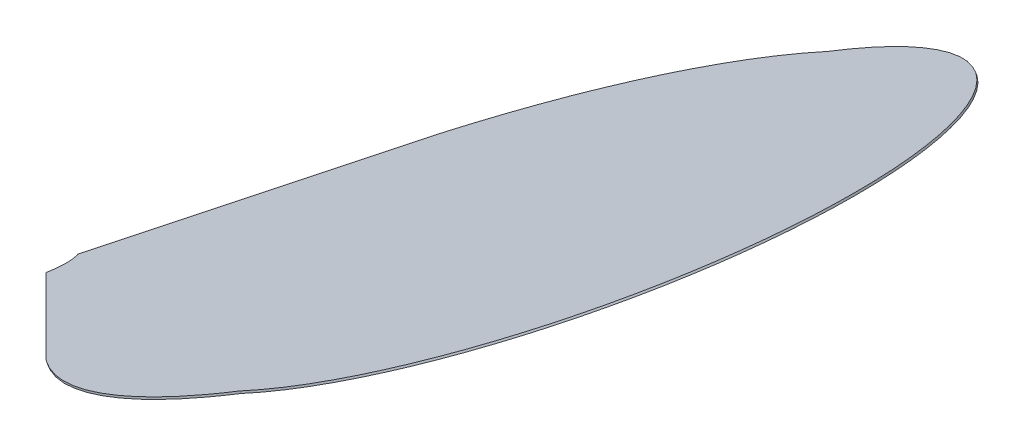
ISO-10303-21;
HEADER;
FILE_DESCRIPTION(('STEP AP214'),'2;1');
FILE_NAME('part.step','',(''),(''),'','','');
FILE_SCHEMA(('AUTOMOTIVE_DESIGN { 1 0 10303 214 1 1 1 1 }'));
ENDSEC;
DATA;
#1=APPLICATION_CONTEXT('core data for automotive mechanical design processes');
#2=APPLICATION_PROTOCOL_DEFINITION('international standard','automotive_design',2000,#1);
#3=PRODUCT_CONTEXT('',#1,'mechanical');
#4=PRODUCT('Part','Part','',(#3));
#5=PRODUCT_RELATED_PRODUCT_CATEGORY('part','',(#4));
#6=PRODUCT_DEFINITION_FORMATION('','',#4);
#7=PRODUCT_DEFINITION_CONTEXT('part definition',#1,'design');
#8=PRODUCT_DEFINITION('design','',#6,#7);
#9=PRODUCT_DEFINITION_SHAPE('','',#8);
#10=(LENGTH_UNIT() NAMED_UNIT(*) SI_UNIT(.MILLI.,.METRE.));
#11=(NAMED_UNIT(*) PLANE_ANGLE_UNIT() SI_UNIT($,.RADIAN.));
#12=(NAMED_UNIT(*) SI_UNIT($,.STERADIAN.) SOLID_ANGLE_UNIT());
#13=UNCERTAINTY_MEASURE_WITH_UNIT(LENGTH_MEASURE(1.E-05),#10,'distance_accuracy_value','');
#14=(GEOMETRIC_REPRESENTATION_CONTEXT(3) GLOBAL_UNCERTAINTY_ASSIGNED_CONTEXT((#13)) GLOBAL_UNIT_ASSIGNED_CONTEXT((#10,
#11,#12)) REPRESENTATION_CONTEXT('',''));
#15=CARTESIAN_POINT('',(0.,0.,0.));
#16=DIRECTION('',(0.,0.,1.));
#17=DIRECTION('',(1.,0.,0.));
#18=AXIS2_PLACEMENT_3D('',#15,#16,#17);
#19=CARTESIAN_POINT('',(0.,0.,-150.));
#20=DIRECTION('',(-0.499999999999995,0.866025403784442,0.));
#21=DIRECTION('',(-0.866025403784442,-0.499999999999995,0.));
#22=AXIS2_PLACEMENT_3D('',#19,#20,#21);
#23=PLANE('',#22);
#24=CARTESIAN_POINT('',(12.2058784741095,7.04706722272291,-8.23725150751261));
#25=CARTESIAN_POINT('',(12.9628824333083,7.48412366234393,-7.05146758809159));
#26=CARTESIAN_POINT('',(14.1813678511022,8.18761654631087,-4.38682913344705));
#27=CARTESIAN_POINT('',(14.8064303914789,8.54849657225766,0.));
#28=CARTESIAN_POINT('',(14.1813678511022,8.18761654631087,4.38682913344705));
#29=CARTESIAN_POINT('',(12.9628824333083,7.48412366234392,7.05146758809159));
#30=CARTESIAN_POINT('',(12.2058784741095,7.04706722272291,8.23725150751261));
#31=B_SPLINE_CURVE_WITH_KNOTS('',3,(#24,#25,#26,#27,#28,#29,#30),.UNSPECIFIED.,.F.,.F.,(4,1,1,1,
4),(-0.568176996088007,-0.284088498044004,0.,0.284088498044003,0.568176996088007),.UNSPECIFIED.);
#32=CARTESIAN_POINT('',(12.3974491341143,7.15767059169628,-7.92882216751736));
#33=VERTEX_POINT('',#32);
#34=CARTESIAN_POINT('',(12.3974491341143,7.15767059169634,7.92882216751734));
#35=VERTEX_POINT('',#34);
#36=EDGE_CURVE('E140',#33,#35,#31,.T.);
#37=ORIENTED_EDGE('',*,*,#36,.T.);
#38=DIRECTION('',(0.654653670707977,0.377964473009222,0.65465367070798));
#39=VECTOR('',#38,1.);
#40=CARTESIAN_POINT('',(-62.3705884428873,-36.0096760270158,-66.8392154094845));
#41=LINE('',#40,#39);
#42=CARTESIAN_POINT('',(101.719193712028,58.7276039022445,97.2505667454315));
#43=VERTEX_POINT('',#42);
#44=EDGE_CURVE('E99',#35,#43,#41,.T.);
#45=ORIENTED_EDGE('',*,*,#44,.T.);
#46=CARTESIAN_POINT('',(93.1221963658504,53.7641251393522,89.1535693992538));
#47=CARTESIAN_POINT('',(95.6283004849128,55.2110250271101,91.6596735183163));
#48=CARTESIAN_POINT('',(100.742093603827,58.1634748608953,96.5052856299092));
#49=CARTESIAN_POINT('',(111.514679607343,64.3830302898936,105.669867744615));
#50=CARTESIAN_POINT('',(125.86744153823,72.6696012543056,116.009698513083));
#51=CARTESIAN_POINT('',(144.336519193102,83.3327282100299,126.509368206678));
#52=CARTESIAN_POINT('',(170.329181574017,98.3395988326057,137.793650740662));
#53=CARTESIAN_POINT('',(197.92722691267,114.273337737985,144.795677830597));
#54=CARTESIAN_POINT('',(226.176204322237,130.58289244973,147.267989887369));
#55=CARTESIAN_POINT('',(240.349980729174,138.766126073708,146.984239250645));
#56=CARTESIAN_POINT('',(247.410656238693,142.84260897979,146.46266869206));
#57=B_SPLINE_CURVE_WITH_KNOTS('',3,(#46,#47,#48,#49,#50,#51,#52,#53,#54,#55,#56),.UNSPECIFIED.,
.F.,.F.,(4,1,1,1,1,1,1,1,4),(0.785398163397446,0.839094039676253,0.89278991595506,
1.00018166851267,1.10757342107029,1.2149651736279,1.42974867874313,1.53714043130074,
1.64453218385836),.UNSPECIFIED.);
#58=CARTESIAN_POINT('',(247.410656238693,142.842608979789,146.46266869206));
#59=VERTEX_POINT('',#58);
#60=EDGE_CURVE('E107',#43,#59,#57,.T.);
#61=ORIENTED_EDGE('',*,*,#60,.T.);
#62=CARTESIAN_POINT('',(247.410656238693,142.842608979789,146.46266869206));
#63=CARTESIAN_POINT('',(257.559432657815,148.702007777315,147.330584572991));
#64=CARTESIAN_POINT('',(278.070821241372,160.544263497484,146.958661647188));
#65=CARTESIAN_POINT('',(308.032473226521,177.842631336476,140.092061217426));
#66=CARTESIAN_POINT('',(335.92786184046,193.948041461882,127.222555213971));
#67=CARTESIAN_POINT('',(360.549792866181,208.16351996755,108.916506256154));
#68=CARTESIAN_POINT('',(380.850690824592,219.88424886863,85.9773415858329));
#69=CARTESIAN_POINT('',(395.975908500579,228.616797365413,59.4031294726966));
#70=CARTESIAN_POINT('',(405.301735636744,234.001066172894,30.3347213663859));
#71=CARTESIAN_POINT('',(408.452017864598,235.819882465168,-2.42861286636753E-13));
#72=CARTESIAN_POINT('',(405.301735636744,234.001066172894,-30.3347213663864));
#73=CARTESIAN_POINT('',(395.975908500578,228.616797365412,-59.403129472697));
#74=CARTESIAN_POINT('',(380.850690824591,219.88424886863,-85.9773415858333));
#75=CARTESIAN_POINT('',(360.54979286618,208.16351996755,-108.916506256154));
#76=CARTESIAN_POINT('',(335.92786184046,193.948041461882,-127.222555213971));
#77=CARTESIAN_POINT('',(308.032473226521,177.842631336475,-140.092061217426));
#78=CARTESIAN_POINT('',(278.070821241371,160.544263497484,-146.958661647188));
#79=CARTESIAN_POINT('',(257.559432657814,148.702007777314,-147.330584572991));
#80=CARTESIAN_POINT('',(247.410656238693,142.842608979789,-146.46266869206));
#81=B_SPLINE_CURVE_WITH_KNOTS('',3,(#62,#63,#64,#65,#66,#67,#68,#69,#70,#71,#72,#73,#74,#75,#76,
#77,#78,#79,#80),.UNSPECIFIED.,.F.,.F.,(4,1,1,1,1,1,1,1,1,1,1,1,1,1,1,1,4),(1.48548463655244,
1.69249813868211,1.89951164081178,2.10652514294145,2.31353864507112,2.52055214720079,
2.72756564933046,2.93457915146013,3.14159265358979,3.34860615571946,3.55561965784913,
3.7626331599788,3.96964666210847,4.17666016423814,4.38367366636781,4.59068716849748,
4.79770067062715),.UNSPECIFIED.);
#82=CARTESIAN_POINT('',(247.410656238693,142.842608979789,-146.46266869206));
#83=VERTEX_POINT('',#82);
#84=EDGE_CURVE('E181',#59,#83,#81,.T.);
#85=ORIENTED_EDGE('',*,*,#84,.T.);
#86=CARTESIAN_POINT('',(247.410656238693,142.842608979789,-146.46266869206));
#87=CARTESIAN_POINT('',(240.349980729174,138.766126073708,-146.984239250645));
#88=CARTESIAN_POINT('',(226.176204322237,130.582892449729,-147.267989887369));
#89=CARTESIAN_POINT('',(197.92722691267,114.273337737984,-144.795677830597));
#90=CARTESIAN_POINT('',(170.329181574016,98.3395988326055,-137.793650740662));
#91=CARTESIAN_POINT('',(144.336519193102,83.3327282100298,-126.509368206677));
#92=CARTESIAN_POINT('',(125.86744153823,72.6696012543055,-116.009698513083));
#93=CARTESIAN_POINT('',(111.514679607343,64.3830302898936,-105.669867744615));
#94=CARTESIAN_POINT('',(100.742093603827,58.1634748608953,-96.5052856299092));
#95=CARTESIAN_POINT('',(95.6283004849128,55.2110250271101,-91.6596735183163));
#96=CARTESIAN_POINT('',(93.1221963658504,53.7641251393522,-89.1535693992538));
#97=B_SPLINE_CURVE_WITH_KNOTS('',3,(#86,#87,#88,#89,#90,#91,#92,#93,#94,#95,#96),.UNSPECIFIED.,
.F.,.F.,(4,1,1,1,1,1,1,1,4),(-1.64453218385836,-1.53714043130074,-1.42974867874313,
-1.2149651736279,-1.10757342107029,-1.00018166851267,-0.89278991595506,-0.839094039676253,
-0.785398163397446),.UNSPECIFIED.);
#98=CARTESIAN_POINT('',(101.719193712028,58.7276039022442,-97.250566745431));
#99=VERTEX_POINT('',#98);
#100=EDGE_CURVE('E42',#83,#99,#97,.T.);
#101=ORIENTED_EDGE('',*,*,#100,.T.);
#102=DIRECTION('',(-0.654653670707977,-0.377964473009222,0.65465367070798));
#103=VECTOR('',#102,1.);
#104=CARTESIAN_POINT('',(66.2008401285419,38.2210728687925,-61.7322131619452));
#105=LINE('',#104,#103);
#106=EDGE_CURVE('E178',#99,#33,#105,.T.);
#107=ORIENTED_EDGE('',*,*,#106,.T.);
#108=EDGE_LOOP('',(#37,#45,#61,#85,#101,#107));
#109=FACE_BOUND('',#108,.T.);
#110=ADVANCED_FACE('F39',(#109),#23,.T.);
#111=CARTESIAN_POINT('',(113.08524739325,-167.681125180715,-8.23725150751261));
#112=CARTESIAN_POINT('',(113.842251352449,-167.244068741094,-7.05146758809159));
#113=CARTESIAN_POINT('',(115.060736770242,-166.540575857127,-4.38682913344705));
#114=CARTESIAN_POINT('',(115.685799310619,-166.17969583118,0.));
#115=CARTESIAN_POINT('',(115.060736770242,-166.540575857127,4.38682913344705));
#116=CARTESIAN_POINT('',(113.842251352449,-167.244068741094,7.05146758809159));
#117=CARTESIAN_POINT('',(113.08524739325,-167.681125180715,8.23725150751261));
#118=B_SPLINE_CURVE_WITH_KNOTS('',3,(#111,#112,#113,#114,#115,#116,#117),.UNSPECIFIED.,.F.,.F.,
(4,1,1,1,4),(-0.568176996088007,-0.284088498044004,0.,0.284088498044003,0.568176996088007),.UNSPECIFIED.);
#119=DIRECTION('',(-0.499999999999995,0.866025403784442,0.));
#120=VECTOR('',#119,1.);
#121=SURFACE_OF_LINEAR_EXTRUSION('',#118,#120);
#122=CARTESIAN_POINT('',(12.7058784741095,6.1810418189385,-8.23725150751261));
#123=CARTESIAN_POINT('',(13.4628824333083,6.61809825855952,-7.05146758809159));
#124=CARTESIAN_POINT('',(14.6813678511022,7.32159114252645,-4.38682913344705));
#125=CARTESIAN_POINT('',(15.3064303914788,7.68247116847326,0.));
#126=CARTESIAN_POINT('',(14.6813678511022,7.32159114252645,4.38682913344705));
#127=CARTESIAN_POINT('',(13.4628824333083,6.6180982585595,7.05146758809159));
#128=CARTESIAN_POINT('',(12.7058784741095,6.1810418189385,8.23725150751261));
#129=B_SPLINE_CURVE_WITH_KNOTS('',3,(#122,#123,#124,#125,#126,#127,#128),.UNSPECIFIED.,.F.,.F.,
(4,1,1,1,4),(-0.568176996088007,-0.284088498044004,0.,0.284088498044003,0.568176996088007),.UNSPECIFIED.);
#130=CARTESIAN_POINT('',(12.8974491295272,6.29164518841272,7.92882217285263));
#131=VERTEX_POINT('',#130);
#132=CARTESIAN_POINT('',(12.8974491327507,6.29164519027376,-7.92882216751736));
#133=VERTEX_POINT('',#132);
#134=EDGE_CURVE('E133',#131,#133,#129,.F.);
#135=ORIENTED_EDGE('',*,*,#134,.F.);
#136=DIRECTION('',(-0.499999999999995,0.866025403784442,0.));
#137=VECTOR('',#136,1.);
#138=CARTESIAN_POINT('',(12.3974491341143,7.15767059169634,7.92882216751734));
#139=LINE('',#138,#137);
#140=EDGE_CURVE('E64',#35,#131,#139,.F.);
#141=ORIENTED_EDGE('',*,*,#140,.F.);
#142=ORIENTED_EDGE('',*,*,#36,.F.);
#143=DIRECTION('',(-0.499999999999995,0.866025403784442,0.));
#144=VECTOR('',#143,1.);
#145=CARTESIAN_POINT('',(12.3974491341143,7.15767059169628,-7.92882216751736));
#146=LINE('',#145,#144);
#147=EDGE_CURVE('E214',#33,#133,#146,.F.);
#148=ORIENTED_EDGE('',*,*,#147,.T.);
#149=EDGE_LOOP('',(#135,#141,#142,#148));
#150=FACE_BOUND('',#149,.T.);
#151=ADVANCED_FACE('F156',(#150),#121,.T.);
#152=CARTESIAN_POINT('',(348.290025157833,-31.8855834236487,-146.46266869206));
#153=CARTESIAN_POINT('',(341.229349648314,-35.9620663297301,-146.984239250645));
#154=CARTESIAN_POINT('',(327.055573241377,-44.1452999537085,-147.267989887369));
#155=CARTESIAN_POINT('',(298.80659583181,-60.4548546654535,-144.795677830597));
#156=CARTESIAN_POINT('',(271.208550493156,-76.3885935708324,-137.793650740662));
#157=CARTESIAN_POINT('',(245.215888112242,-91.3954641934081,-126.509368206677));
#158=CARTESIAN_POINT('',(226.74681045737,-102.058591149132,-116.009698513083));
#159=CARTESIAN_POINT('',(212.394048526483,-110.345162113544,-105.669867744615));
#160=CARTESIAN_POINT('',(201.621462522967,-116.564717542543,-96.5052856299092));
#161=CARTESIAN_POINT('',(196.507669404053,-119.517167376328,-91.6596735183163));
#162=CARTESIAN_POINT('',(194.001565284991,-120.964067264086,-89.1535693992538));
#163=B_SPLINE_CURVE_WITH_KNOTS('',3,(#152,#153,#154,#155,#156,#157,#158,#159,#160,#161,#162),
.UNSPECIFIED.,.F.,.F.,(4,1,1,1,1,1,1,1,4),(-1.64453218385836,-1.53714043130074,
-1.42974867874313,-1.2149651736279,-1.10757342107029,-1.00018166851267,-0.89278991595506,
-0.839094039676253,-0.785398163397446),.UNSPECIFIED.);
#164=DIRECTION('',(-0.499999999999995,0.866025403784442,0.));
#165=VECTOR('',#164,1.);
#166=SURFACE_OF_LINEAR_EXTRUSION('',#163,#165);
#167=CARTESIAN_POINT('',(247.910656238693,141.976583576005,-146.46266869206));
#168=CARTESIAN_POINT('',(240.849980729174,137.900100669923,-146.984239250645));
#169=CARTESIAN_POINT('',(226.676204322237,129.716867045945,-147.267989887369));
#170=CARTESIAN_POINT('',(198.42722691267,113.4073123342,-144.795677830597));
#171=CARTESIAN_POINT('',(170.829181574016,97.4735734288211,-137.793650740662));
#172=CARTESIAN_POINT('',(144.836519193102,82.4667028062454,-126.509368206677));
#173=CARTESIAN_POINT('',(126.36744153823,71.8035758505211,-116.009698513083));
#174=CARTESIAN_POINT('',(112.014679607343,63.5170048861091,-105.669867744615));
#175=CARTESIAN_POINT('',(101.242093603827,57.2974494571109,-96.5052856299092));
#176=CARTESIAN_POINT('',(96.1283004849128,54.3449996233257,-91.6596735183163));
#177=CARTESIAN_POINT('',(93.6221963658503,52.8980997355677,-89.1535693992538));
#178=B_SPLINE_CURVE_WITH_KNOTS('',3,(#167,#168,#169,#170,#171,#172,#173,#174,#175,#176,#177),
.UNSPECIFIED.,.F.,.F.,(4,1,1,1,1,1,1,1,4),(-1.64453218385836,-1.53714043130074,
-1.42974867874313,-1.2149651736279,-1.10757342107029,-1.00018166851267,-0.89278991595506,
-0.839094039676253,-0.785398163397446),.UNSPECIFIED.);
#179=CARTESIAN_POINT('',(102.219193607347,57.8615784071685,-97.2505666407509));
#180=VERTEX_POINT('',#179);
#181=CARTESIAN_POINT('',(247.910656238693,141.976583576005,-146.46266869206));
#182=VERTEX_POINT('',#181);
#183=EDGE_CURVE('E114',#180,#182,#178,.F.);
#184=ORIENTED_EDGE('',*,*,#183,.F.);
#185=DIRECTION('',(-0.499999999999995,0.866025403784442,0.));
#186=VECTOR('',#185,1.);
#187=CARTESIAN_POINT('',(101.719193712028,58.7276039022442,-97.250566745431));
#188=LINE('',#187,#186);
#189=EDGE_CURVE('E56',#99,#180,#188,.F.);
#190=ORIENTED_EDGE('',*,*,#189,.F.);
#191=ORIENTED_EDGE('',*,*,#100,.F.);
#192=DIRECTION('',(-0.499999999999995,0.866025403784442,0.));
#193=VECTOR('',#192,1.);
#194=CARTESIAN_POINT('',(348.290025157833,-31.8855834236487,-146.46266869206));
#195=LINE('',#194,#193);
#196=EDGE_CURVE('E11',#182,#83,#195,.T.);
#197=ORIENTED_EDGE('',*,*,#196,.F.);
#198=EDGE_LOOP('',(#184,#190,#191,#197));
#199=FACE_BOUND('',#198,.T.);
#200=ADVANCED_FACE('F159',(#199),#166,.T.);
#201=CARTESIAN_POINT('',(194.001565284991,-120.964067264086,89.1535693992538));
#202=CARTESIAN_POINT('',(196.507669404053,-119.517167376328,91.6596735183163));
#203=CARTESIAN_POINT('',(201.621462522967,-116.564717542543,96.5052856299092));
#204=CARTESIAN_POINT('',(212.394048526483,-110.345162113544,105.669867744615));
#205=CARTESIAN_POINT('',(226.74681045737,-102.058591149132,116.009698513083));
#206=CARTESIAN_POINT('',(245.215888112242,-91.3954641934079,126.509368206678));
#207=CARTESIAN_POINT('',(271.208550493157,-76.3885935708322,137.793650740662));
#208=CARTESIAN_POINT('',(298.80659583181,-60.4548546654533,144.795677830597));
#209=CARTESIAN_POINT('',(327.055573241378,-44.1452999537082,147.267989887369));
#210=CARTESIAN_POINT('',(341.229349648314,-35.9620663297298,146.984239250645));
#211=CARTESIAN_POINT('',(348.290025157833,-31.8855834236484,146.46266869206));
#212=B_SPLINE_CURVE_WITH_KNOTS('',3,(#201,#202,#203,#204,#205,#206,#207,#208,#209,#210,#211),
.UNSPECIFIED.,.F.,.F.,(4,1,1,1,1,1,1,1,4),(0.785398163397446,0.839094039676253,0.89278991595506,
1.00018166851267,1.10757342107029,1.2149651736279,1.42974867874313,1.53714043130074,
1.64453218385836),.UNSPECIFIED.);
#213=DIRECTION('',(-0.499999999999995,0.866025403784442,0.));
#214=VECTOR('',#213,1.);
#215=SURFACE_OF_LINEAR_EXTRUSION('',#212,#214);
#216=ORIENTED_EDGE('',*,*,#60,.F.);
#217=DIRECTION('',(-0.499999999999995,0.866025403784442,0.));
#218=VECTOR('',#217,1.);
#219=CARTESIAN_POINT('',(101.719193712028,58.7276039022445,97.2505667454315));
#220=LINE('',#219,#218);
#221=CARTESIAN_POINT('',(102.219193722525,57.8615784736665,97.2505667492487));
#222=VERTEX_POINT('',#221);
#223=EDGE_CURVE('E93',#43,#222,#220,.F.);
#224=ORIENTED_EDGE('',*,*,#223,.T.);
#225=CARTESIAN_POINT('',(93.6221963658504,52.8980997355678,89.1535693992538));
#226=CARTESIAN_POINT('',(96.1283004849128,54.3449996233257,91.6596735183163));
#227=CARTESIAN_POINT('',(101.242093603827,57.2974494571109,96.5052856299092));
#228=CARTESIAN_POINT('',(112.014679607343,63.5170048861093,105.669867744615));
#229=CARTESIAN_POINT('',(126.36744153823,71.8035758505212,116.009698513083));
#230=CARTESIAN_POINT('',(144.836519193102,82.4667028062456,126.509368206678));
#231=CARTESIAN_POINT('',(170.829181574016,97.4735734288214,137.793650740662));
#232=CARTESIAN_POINT('',(198.42722691267,113.4073123342,144.795677830597));
#233=CARTESIAN_POINT('',(226.676204322237,129.716867045945,147.267989887369));
#234=CARTESIAN_POINT('',(240.849980729174,137.900100669924,146.984239250645));
#235=CARTESIAN_POINT('',(247.910656238693,141.976583576005,146.46266869206));
#236=B_SPLINE_CURVE_WITH_KNOTS('',3,(#225,#226,#227,#228,#229,#230,#231,#232,#233,#234,#235),
.UNSPECIFIED.,.F.,.F.,(4,1,1,1,1,1,1,1,4),(0.785398163397446,0.839094039676253,0.89278991595506,
1.00018166851267,1.10757342107029,1.2149651736279,1.42974867874313,1.53714043130074,
1.64453218385836),.UNSPECIFIED.);
#237=CARTESIAN_POINT('',(247.910656238693,141.976583576005,146.46266869206));
#238=VERTEX_POINT('',#237);
#239=EDGE_CURVE('E105',#238,#222,#236,.F.);
#240=ORIENTED_EDGE('',*,*,#239,.F.);
#241=DIRECTION('',(-0.499999999999995,0.866025403784442,0.));
#242=VECTOR('',#241,1.);
#243=CARTESIAN_POINT('',(348.290025157833,-31.8855834236484,146.46266869206));
#244=LINE('',#243,#242);
#245=EDGE_CURVE('E48',#238,#59,#244,.T.);
#246=ORIENTED_EDGE('',*,*,#245,.T.);
#247=EDGE_LOOP('',(#216,#224,#240,#246));
#248=FACE_BOUND('',#247,.T.);
#249=ADVANCED_FACE('F103',(#248),#215,.T.);
#250=CARTESIAN_POINT('',(0.499999999999995,-0.866025403784442,-150.));
#251=DIRECTION('',(-0.499999999999995,0.866025403784442,0.));
#252=DIRECTION('',(-0.866025403784442,-0.499999999999995,0.));
#253=AXIS2_PLACEMENT_3D('',#250,#251,#252);
#254=PLANE('',#253);
#255=DIRECTION('',(0.654653670707977,0.377964473009222,0.65465367070798));
#256=VECTOR('',#255,1.);
#257=CARTESIAN_POINT('',(-61.8705884428873,-36.8757014308003,-66.8392154094845));
#258=LINE('',#257,#256);
#259=EDGE_CURVE('E90',#131,#222,#258,.T.);
#260=ORIENTED_EDGE('',*,*,#259,.F.);
#261=ORIENTED_EDGE('',*,*,#134,.T.);
#262=DIRECTION('',(-0.654653670707977,-0.377964473009222,0.65465367070798));
#263=VECTOR('',#262,1.);
#264=CARTESIAN_POINT('',(66.7008401285419,37.3550474650081,-61.7322131619452));
#265=LINE('',#264,#263);
#266=EDGE_CURVE('E215',#180,#133,#265,.T.);
#267=ORIENTED_EDGE('',*,*,#266,.F.);
#268=ORIENTED_EDGE('',*,*,#183,.T.);
#269=CARTESIAN_POINT('',(247.910656238693,141.976583576005,146.46266869206));
#270=CARTESIAN_POINT('',(258.059432657815,147.83598237353,147.330584572991));
#271=CARTESIAN_POINT('',(278.570821241372,159.6782380937,146.958661647188));
#272=CARTESIAN_POINT('',(308.532473226521,176.976605932691,140.092061217426));
#273=CARTESIAN_POINT('',(336.42786184046,193.082016058098,127.222555213971));
#274=CARTESIAN_POINT('',(361.049792866181,207.297494563766,108.916506256154));
#275=CARTESIAN_POINT('',(381.350690824591,219.018223464846,85.9773415858329));
#276=CARTESIAN_POINT('',(396.475908500578,227.750771961628,59.4031294726966));
#277=CARTESIAN_POINT('',(405.801735636744,233.135040769109,30.3347213663859));
#278=CARTESIAN_POINT('',(408.952017864598,234.953857061384,-2.42861286636753E-13));
#279=CARTESIAN_POINT('',(405.801735636744,233.135040769109,-30.3347213663864));
#280=CARTESIAN_POINT('',(396.475908500578,227.750771961628,-59.403129472697));
#281=CARTESIAN_POINT('',(381.350690824591,219.018223464845,-85.9773415858333));
#282=CARTESIAN_POINT('',(361.04979286618,207.297494563766,-108.916506256154));
#283=CARTESIAN_POINT('',(336.42786184046,193.082016058098,-127.222555213971));
#284=CARTESIAN_POINT('',(308.532473226521,176.976605932691,-140.092061217426));
#285=CARTESIAN_POINT('',(278.570821241371,159.678238093699,-146.958661647188));
#286=CARTESIAN_POINT('',(258.059432657814,147.83598237353,-147.330584572991));
#287=CARTESIAN_POINT('',(247.910656238693,141.976583576005,-146.46266869206));
#288=B_SPLINE_CURVE_WITH_KNOTS('',3,(#269,#270,#271,#272,#273,#274,#275,#276,#277,#278,#279,
#280,#281,#282,#283,#284,#285,#286,#287),.UNSPECIFIED.,.F.,.F.,(4,1,1,1,1,1,1,1,1,1,1,1,1,1,1,1,
4),(1.48548463655244,1.69249813868211,1.89951164081178,2.10652514294145,2.31353864507112,
2.52055214720079,2.72756564933046,2.93457915146013,3.14159265358979,3.34860615571946,
3.55561965784913,3.7626331599788,3.96964666210847,4.17666016423814,4.38367366636781,
4.59068716849748,4.79770067062715),.UNSPECIFIED.);
#289=EDGE_CURVE('E112',#182,#238,#288,.F.);
#290=ORIENTED_EDGE('',*,*,#289,.T.);
#291=ORIENTED_EDGE('',*,*,#239,.T.);
#292=EDGE_LOOP('',(#260,#261,#267,#268,#290,#291));
#293=FACE_BOUND('',#292,.T.);
#294=ADVANCED_FACE('F110',(#293),#254,.F.);
#295=CARTESIAN_POINT('',(348.290025157833,-31.8855834236484,146.46266869206));
#296=CARTESIAN_POINT('',(358.438801576955,-26.0261846261233,147.330584572991));
#297=CARTESIAN_POINT('',(378.950190160512,-14.1839289059539,146.958661647188));
#298=CARTESIAN_POINT('',(408.911842145661,3.11443893303778,140.092061217426));
#299=CARTESIAN_POINT('',(436.8072307596,19.2198490584444,127.222555213971));
#300=CARTESIAN_POINT('',(461.429161785321,33.4353275641125,108.916506256154));
#301=CARTESIAN_POINT('',(481.730059743732,45.156056465192,85.9773415858329));
#302=CARTESIAN_POINT('',(496.855277419719,53.8886049619746,59.4031294726966));
#303=CARTESIAN_POINT('',(506.181104555885,59.2728737694558,30.3347213663859));
#304=CARTESIAN_POINT('',(509.331386783738,61.0916900617304,-2.42861286636753E-13));
#305=CARTESIAN_POINT('',(506.181104555885,59.2728737694558,-30.3347213663864));
#306=CARTESIAN_POINT('',(496.855277419719,53.8886049619745,-59.403129472697));
#307=CARTESIAN_POINT('',(481.730059743732,45.1560564651919,-85.9773415858333));
#308=CARTESIAN_POINT('',(461.429161785321,33.4353275641123,-108.916506256154));
#309=CARTESIAN_POINT('',(436.8072307596,19.2198490584442,-127.222555213971));
#310=CARTESIAN_POINT('',(408.911842145661,3.11443893303756,-140.092061217426));
#311=CARTESIAN_POINT('',(378.950190160511,-14.1839289059542,-146.958661647188));
#312=CARTESIAN_POINT('',(358.438801576954,-26.0261846261236,-147.330584572991));
#313=CARTESIAN_POINT('',(348.290025157833,-31.8855834236487,-146.46266869206));
#314=B_SPLINE_CURVE_WITH_KNOTS('',3,(#295,#296,#297,#298,#299,#300,#301,#302,#303,#304,#305,
#306,#307,#308,#309,#310,#311,#312,#313),.UNSPECIFIED.,.F.,.F.,(4,1,1,1,1,1,1,1,1,1,1,1,1,1,1,1,
4),(1.48548463655244,1.69249813868211,1.89951164081178,2.10652514294145,2.31353864507112,
2.52055214720079,2.72756564933046,2.93457915146013,3.14159265358979,3.34860615571946,
3.55561965784913,3.7626331599788,3.96964666210847,4.17666016423814,4.38367366636781,
4.59068716849748,4.79770067062715),.UNSPECIFIED.);
#315=DIRECTION('',(-0.499999999999995,0.866025403784442,0.));
#316=VECTOR('',#315,1.);
#317=SURFACE_OF_LINEAR_EXTRUSION('',#314,#316);
#318=ORIENTED_EDGE('',*,*,#196,.T.);
#319=ORIENTED_EDGE('',*,*,#84,.F.);
#320=ORIENTED_EDGE('',*,*,#245,.F.);
#321=ORIENTED_EDGE('',*,*,#289,.F.);
#322=EDGE_LOOP('',(#318,#319,#320,#321));
#323=FACE_BOUND('',#322,.T.);
#324=ADVANCED_FACE('F163',(#323),#317,.T.);
#325=CARTESIAN_POINT('',(66.2008401285419,38.2210728687925,-61.7322131619452));
#326=DIRECTION('',(-0.566946709513845,-0.327326835353987,-0.755928946018452));
#327=DIRECTION('',(-0.654653670707977,-0.377964473009222,0.65465367070798));
#328=AXIS2_PLACEMENT_3D('',#325,#326,#327);
#329=PLANE('',#328);
#330=ORIENTED_EDGE('',*,*,#147,.F.);
#331=ORIENTED_EDGE('',*,*,#106,.F.);
#332=ORIENTED_EDGE('',*,*,#189,.T.);
#333=ORIENTED_EDGE('',*,*,#266,.T.);
#334=EDGE_LOOP('',(#330,#331,#332,#333));
#335=FACE_BOUND('',#334,.T.);
#336=ADVANCED_FACE('F168',(#335),#329,.T.);
#337=CARTESIAN_POINT('',(-62.3705884428873,-36.0096760270158,-66.8392154094845));
#338=DIRECTION('',(-0.566946709513845,-0.327326835353987,0.755928946018452));
#339=DIRECTION('',(0.654653670707977,0.377964473009222,0.65465367070798));
#340=AXIS2_PLACEMENT_3D('',#337,#338,#339);
#341=PLANE('',#340);
#342=ORIENTED_EDGE('',*,*,#223,.F.);
#343=ORIENTED_EDGE('',*,*,#44,.F.);
#344=ORIENTED_EDGE('',*,*,#140,.T.);
#345=ORIENTED_EDGE('',*,*,#259,.T.);
#346=EDGE_LOOP('',(#342,#343,#344,#345));
#347=FACE_BOUND('',#346,.T.);
#348=ADVANCED_FACE('F92',(#347),#341,.T.);
#349=CLOSED_SHELL('',(#110,#151,#200,#249,#294,#324,#336,#348));
#350=MANIFOLD_SOLID_BREP('B2',#349);
#351=ADVANCED_BREP_SHAPE_REPRESENTATION('',(#18,#350),#14);
#352=SHAPE_DEFINITION_REPRESENTATION(#9,#351);
ENDSEC;
END-ISO-10303-21;
